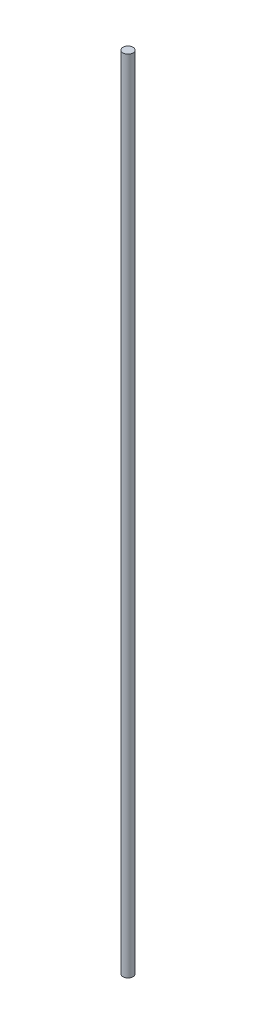
ISO-10303-21;
HEADER;
FILE_DESCRIPTION(('STEP AP214'),'2;1');
FILE_NAME('part.step','',(''),(''),'','','');
FILE_SCHEMA(('AUTOMOTIVE_DESIGN { 1 0 10303 214 1 1 1 1 }'));
ENDSEC;
DATA;
#1=APPLICATION_CONTEXT('core data for automotive mechanical design processes');
#2=APPLICATION_PROTOCOL_DEFINITION('international standard','automotive_design',2000,#1);
#3=PRODUCT_CONTEXT('',#1,'mechanical');
#4=PRODUCT('Part','Part','',(#3));
#5=PRODUCT_RELATED_PRODUCT_CATEGORY('part','',(#4));
#6=PRODUCT_DEFINITION_FORMATION('','',#4);
#7=PRODUCT_DEFINITION_CONTEXT('part definition',#1,'design');
#8=PRODUCT_DEFINITION('design','',#6,#7);
#9=PRODUCT_DEFINITION_SHAPE('','',#8);
#10=(LENGTH_UNIT() NAMED_UNIT(*) SI_UNIT(.MILLI.,.METRE.));
#11=(NAMED_UNIT(*) PLANE_ANGLE_UNIT() SI_UNIT($,.RADIAN.));
#12=(NAMED_UNIT(*) SI_UNIT($,.STERADIAN.) SOLID_ANGLE_UNIT());
#13=UNCERTAINTY_MEASURE_WITH_UNIT(LENGTH_MEASURE(1.E-05),#10,'distance_accuracy_value','');
#14=(GEOMETRIC_REPRESENTATION_CONTEXT(3) GLOBAL_UNCERTAINTY_ASSIGNED_CONTEXT((#13)) GLOBAL_UNIT_ASSIGNED_CONTEXT((#10,
#11,#12)) REPRESENTATION_CONTEXT('',''));
#15=CARTESIAN_POINT('',(0.,0.,0.));
#16=DIRECTION('',(0.,0.,1.));
#17=DIRECTION('',(1.,0.,0.));
#18=AXIS2_PLACEMENT_3D('',#15,#16,#17);
#19=CARTESIAN_POINT('',(0.,400.,0.));
#20=DIRECTION('',(0.,-1.,0.));
#21=DIRECTION('',(0.,0.,-1.));
#22=AXIS2_PLACEMENT_3D('',#19,#20,#21);
#23=CYLINDRICAL_SURFACE('',#22,2.5);
#24=CARTESIAN_POINT('',(0.,400.,0.));
#25=DIRECTION('',(0.,1.,0.));
#26=DIRECTION('',(0.,0.,1.));
#27=AXIS2_PLACEMENT_3D('',#24,#25,#26);
#28=CIRCLE('',#27,2.5);
#29=CARTESIAN_POINT('',(0.,400.,2.5));
#30=VERTEX_POINT('',#29);
#31=EDGE_CURVE('E10',#30,#30,#28,.T.);
#32=ORIENTED_EDGE('',*,*,#31,.F.);
#33=EDGE_LOOP('',(#32));
#34=FACE_BOUND('',#33,.T.);
#35=CARTESIAN_POINT('',(0.,0.,0.));
#36=DIRECTION('',(0.,1.,0.));
#37=DIRECTION('',(0.,0.,1.));
#38=AXIS2_PLACEMENT_3D('',#35,#36,#37);
#39=CIRCLE('',#38,2.5);
#40=CARTESIAN_POINT('',(0.,0.,2.5));
#41=VERTEX_POINT('',#40);
#42=EDGE_CURVE('E38',#41,#41,#39,.T.);
#43=ORIENTED_EDGE('',*,*,#42,.T.);
#44=EDGE_LOOP('',(#43));
#45=FACE_BOUND('',#44,.T.);
#46=ADVANCED_FACE('F35',(#34,#45),#23,.T.);
#47=CARTESIAN_POINT('',(0.,400.,0.));
#48=DIRECTION('',(0.,1.,0.));
#49=DIRECTION('',(0.,0.,1.));
#50=AXIS2_PLACEMENT_3D('',#47,#48,#49);
#51=PLANE('',#50);
#52=ORIENTED_EDGE('',*,*,#31,.T.);
#53=EDGE_LOOP('',(#52));
#54=FACE_BOUND('',#53,.T.);
#55=ADVANCED_FACE('F50',(#54),#51,.T.);
#56=CARTESIAN_POINT('',(0.,0.,0.));
#57=DIRECTION('',(0.,1.,0.));
#58=DIRECTION('',(0.,0.,1.));
#59=AXIS2_PLACEMENT_3D('',#56,#57,#58);
#60=PLANE('',#59);
#61=ORIENTED_EDGE('',*,*,#42,.F.);
#62=EDGE_LOOP('',(#61));
#63=FACE_BOUND('',#62,.T.);
#64=ADVANCED_FACE('F48',(#63),#60,.F.);
#65=CLOSED_SHELL('',(#46,#55,#64));
#66=MANIFOLD_SOLID_BREP('B2',#65);
#67=ADVANCED_BREP_SHAPE_REPRESENTATION('',(#18,#66),#14);
#68=SHAPE_DEFINITION_REPRESENTATION(#9,#67);
ENDSEC;
END-ISO-10303-21;
